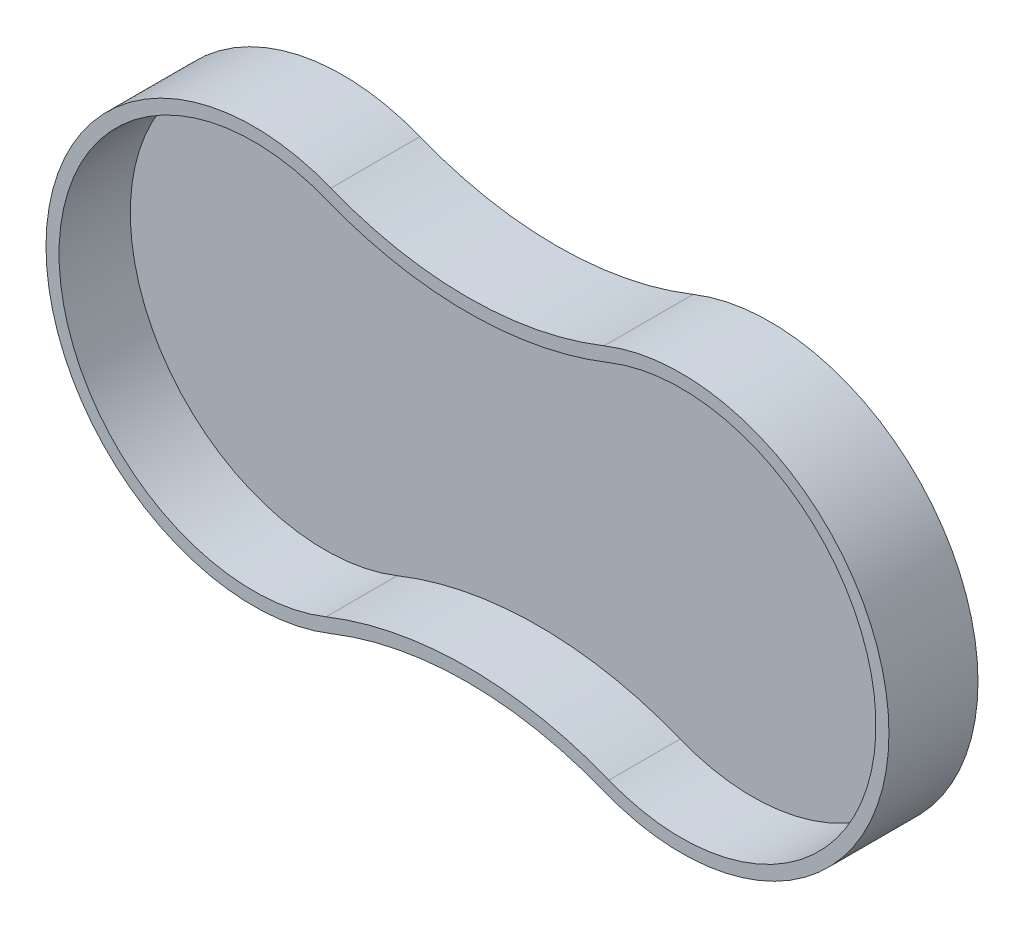
ISO-10303-21;
HEADER;
FILE_DESCRIPTION(('STEP AP214'),'2;1');
FILE_NAME('part.step','',(''),(''),'','','');
FILE_SCHEMA(('AUTOMOTIVE_DESIGN { 1 0 10303 214 1 1 1 1 }'));
ENDSEC;
DATA;
#1=APPLICATION_CONTEXT('core data for automotive mechanical design processes');
#2=APPLICATION_PROTOCOL_DEFINITION('international standard','automotive_design',2000,#1);
#3=PRODUCT_CONTEXT('',#1,'mechanical');
#4=PRODUCT('Part','Part','',(#3));
#5=PRODUCT_RELATED_PRODUCT_CATEGORY('part','',(#4));
#6=PRODUCT_DEFINITION_FORMATION('','',#4);
#7=PRODUCT_DEFINITION_CONTEXT('part definition',#1,'design');
#8=PRODUCT_DEFINITION('design','',#6,#7);
#9=PRODUCT_DEFINITION_SHAPE('','',#8);
#10=(LENGTH_UNIT() NAMED_UNIT(*) SI_UNIT(.MILLI.,.METRE.));
#11=(NAMED_UNIT(*) PLANE_ANGLE_UNIT() SI_UNIT($,.RADIAN.));
#12=(NAMED_UNIT(*) SI_UNIT($,.STERADIAN.) SOLID_ANGLE_UNIT());
#13=UNCERTAINTY_MEASURE_WITH_UNIT(LENGTH_MEASURE(1.E-05),#10,'distance_accuracy_value','');
#14=(GEOMETRIC_REPRESENTATION_CONTEXT(3) GLOBAL_UNCERTAINTY_ASSIGNED_CONTEXT((#13)) GLOBAL_UNIT_ASSIGNED_CONTEXT((#10,
#11,#12)) REPRESENTATION_CONTEXT('',''));
#15=CARTESIAN_POINT('',(0.,0.,0.));
#16=DIRECTION('',(0.,0.,1.));
#17=DIRECTION('',(1.,0.,0.));
#18=AXIS2_PLACEMENT_3D('',#15,#16,#17);
#19=CARTESIAN_POINT('',(18.,45.0333209967907,15.));
#20=DIRECTION('',(0.,0.,1.));
#21=DIRECTION('',(1.,0.,0.));
#22=AXIS2_PLACEMENT_3D('',#19,#20,#21);
#23=PLANE('',#22);
#24=CARTESIAN_POINT('',(0.,90.0666419935814,15.));
#25=DIRECTION('',(0.,0.,-1.));
#26=DIRECTION('',(1.,0.,0.));
#27=AXIS2_PLACEMENT_3D('',#24,#25,#26);
#28=CIRCLE('',#27,61.994845223857);
#29=CARTESIAN_POINT('',(23.0096189432334,32.5,15.));
#30=VERTEX_POINT('',#29);
#31=CARTESIAN_POINT('',(-23.0096189432334,32.5,15.));
#32=VERTEX_POINT('',#31);
#33=EDGE_CURVE('E150',#30,#32,#28,.T.);
#34=ORIENTED_EDGE('',*,*,#33,.T.);
#35=CARTESIAN_POINT('',(-36.,0.,15.));
#36=DIRECTION('',(0.,0.,1.));
#37=DIRECTION('',(1.,0.,0.));
#38=AXIS2_PLACEMENT_3D('',#35,#36,#37);
#39=CIRCLE('',#38,35.);
#40=CARTESIAN_POINT('',(-23.0096189432334,-32.5,15.));
#41=VERTEX_POINT('',#40);
#42=EDGE_CURVE('E89',#32,#41,#39,.T.);
#43=ORIENTED_EDGE('',*,*,#42,.T.);
#44=CARTESIAN_POINT('',(0.,-90.0666419935814,15.));
#45=DIRECTION('',(0.,0.,-1.));
#46=DIRECTION('',(-1.,0.,0.));
#47=AXIS2_PLACEMENT_3D('',#44,#45,#46);
#48=CIRCLE('',#47,61.994845223857);
#49=CARTESIAN_POINT('',(23.0096189432334,-32.5,15.));
#50=VERTEX_POINT('',#49);
#51=EDGE_CURVE('E153',#41,#50,#48,.T.);
#52=ORIENTED_EDGE('',*,*,#51,.T.);
#53=CARTESIAN_POINT('',(36.,0.,15.));
#54=DIRECTION('',(0.,0.,1.));
#55=DIRECTION('',(1.,0.,0.));
#56=AXIS2_PLACEMENT_3D('',#53,#54,#55);
#57=CIRCLE('',#56,35.);
#58=EDGE_CURVE('E61',#50,#30,#57,.T.);
#59=ORIENTED_EDGE('',*,*,#58,.T.);
#60=EDGE_LOOP('',(#34,#43,#52,#59));
#61=FACE_BOUND('',#60,.T.);
#62=CARTESIAN_POINT('',(-36.,0.,15.));
#63=DIRECTION('',(0.,0.,1.));
#64=DIRECTION('',(1.,0.,0.));
#65=AXIS2_PLACEMENT_3D('',#62,#63,#64);
#66=CIRCLE('',#65,32.8);
#67=CARTESIAN_POINT('',(-23.8261571810873,30.4571428571429,15.));
#68=VERTEX_POINT('',#67);
#69=CARTESIAN_POINT('',(-23.8261571810873,-30.4571428571429,15.));
#70=VERTEX_POINT('',#69);
#71=EDGE_CURVE('E52',#68,#70,#66,.T.);
#72=ORIENTED_EDGE('',*,*,#71,.F.);
#73=CARTESIAN_POINT('',(0.,90.0666419935814,15.));
#74=DIRECTION('',(0.,0.,-1.));
#75=DIRECTION('',(1.,0.,0.));
#76=AXIS2_PLACEMENT_3D('',#73,#74,#75);
#77=CIRCLE('',#76,64.194845223857);
#78=CARTESIAN_POINT('',(23.8261571810873,30.4571428571428,15.));
#79=VERTEX_POINT('',#78);
#80=EDGE_CURVE('E131',#79,#68,#77,.T.);
#81=ORIENTED_EDGE('',*,*,#80,.F.);
#82=CARTESIAN_POINT('',(36.,0.,15.));
#83=DIRECTION('',(0.,0.,1.));
#84=DIRECTION('',(1.,0.,0.));
#85=AXIS2_PLACEMENT_3D('',#82,#83,#84);
#86=CIRCLE('',#85,32.8);
#87=CARTESIAN_POINT('',(23.8261571810873,-30.4571428571429,15.));
#88=VERTEX_POINT('',#87);
#89=EDGE_CURVE('E134',#88,#79,#86,.T.);
#90=ORIENTED_EDGE('',*,*,#89,.F.);
#91=CARTESIAN_POINT('',(0.,-90.0666419935814,15.));
#92=DIRECTION('',(0.,0.,-1.));
#93=DIRECTION('',(1.,0.,0.));
#94=AXIS2_PLACEMENT_3D('',#91,#92,#93);
#95=CIRCLE('',#94,64.1948452238569);
#96=EDGE_CURVE('E140',#70,#88,#95,.T.);
#97=ORIENTED_EDGE('',*,*,#96,.F.);
#98=EDGE_LOOP('',(#72,#81,#90,#97));
#99=FACE_BOUND('',#98,.T.);
#100=ADVANCED_FACE('F37',(#61,#99),#23,.T.);
#101=CARTESIAN_POINT('',(0.,90.0666419935814,15.));
#102=DIRECTION('',(0.,0.,-1.));
#103=DIRECTION('',(-1.,0.,0.));
#104=AXIS2_PLACEMENT_3D('',#101,#102,#103);
#105=CYLINDRICAL_SURFACE('',#104,61.994845223857);
#106=CARTESIAN_POINT('',(0.,90.0666419935814,0.));
#107=DIRECTION('',(0.,0.,-1.));
#108=DIRECTION('',(1.,0.,0.));
#109=AXIS2_PLACEMENT_3D('',#106,#107,#108);
#110=CIRCLE('',#109,61.994845223857);
#111=CARTESIAN_POINT('',(23.0096189432334,32.5,0.));
#112=VERTEX_POINT('',#111);
#113=CARTESIAN_POINT('',(-23.0096189432334,32.5,0.));
#114=VERTEX_POINT('',#113);
#115=EDGE_CURVE('E146',#112,#114,#110,.T.);
#116=ORIENTED_EDGE('',*,*,#115,.T.);
#117=DIRECTION('',(0.,0.,-1.));
#118=VECTOR('',#117,1.);
#119=CARTESIAN_POINT('',(-23.0096189432334,32.5,15.));
#120=LINE('',#119,#118);
#121=EDGE_CURVE('E11',#32,#114,#120,.T.);
#122=ORIENTED_EDGE('',*,*,#121,.F.);
#123=ORIENTED_EDGE('',*,*,#33,.F.);
#124=DIRECTION('',(0.,0.,-1.));
#125=VECTOR('',#124,1.);
#126=CARTESIAN_POINT('',(23.0096189432334,32.5,15.));
#127=LINE('',#126,#125);
#128=EDGE_CURVE('E156',#30,#112,#127,.T.);
#129=ORIENTED_EDGE('',*,*,#128,.T.);
#130=EDGE_LOOP('',(#116,#122,#123,#129));
#131=FACE_BOUND('',#130,.T.);
#132=ADVANCED_FACE('F39',(#131),#105,.F.);
#133=CARTESIAN_POINT('',(-36.,0.,15.));
#134=DIRECTION('',(0.,0.,-1.));
#135=DIRECTION('',(-1.,0.,0.));
#136=AXIS2_PLACEMENT_3D('',#133,#134,#135);
#137=CYLINDRICAL_SURFACE('',#136,35.);
#138=CARTESIAN_POINT('',(-36.,0.,0.));
#139=DIRECTION('',(0.,0.,1.));
#140=DIRECTION('',(1.,0.,0.));
#141=AXIS2_PLACEMENT_3D('',#138,#139,#140);
#142=CIRCLE('',#141,35.);
#143=CARTESIAN_POINT('',(-23.0096189432334,-32.5,0.));
#144=VERTEX_POINT('',#143);
#145=EDGE_CURVE('E159',#114,#144,#142,.T.);
#146=ORIENTED_EDGE('',*,*,#145,.T.);
#147=DIRECTION('',(0.,0.,-1.));
#148=VECTOR('',#147,1.);
#149=CARTESIAN_POINT('',(-23.0096189432334,-32.5,15.));
#150=LINE('',#149,#148);
#151=EDGE_CURVE('E45',#41,#144,#150,.T.);
#152=ORIENTED_EDGE('',*,*,#151,.F.);
#153=ORIENTED_EDGE('',*,*,#42,.F.);
#154=ORIENTED_EDGE('',*,*,#121,.T.);
#155=EDGE_LOOP('',(#146,#152,#153,#154));
#156=FACE_BOUND('',#155,.T.);
#157=ADVANCED_FACE('F186',(#156),#137,.T.);
#158=CARTESIAN_POINT('',(0.,-90.0666419935814,15.));
#159=DIRECTION('',(0.,0.,-1.));
#160=DIRECTION('',(-1.,0.,0.));
#161=AXIS2_PLACEMENT_3D('',#158,#159,#160);
#162=CYLINDRICAL_SURFACE('',#161,61.994845223857);
#163=CARTESIAN_POINT('',(0.,-90.0666419935814,0.));
#164=DIRECTION('',(0.,0.,-1.));
#165=DIRECTION('',(-1.,0.,0.));
#166=AXIS2_PLACEMENT_3D('',#163,#164,#165);
#167=CIRCLE('',#166,61.994845223857);
#168=CARTESIAN_POINT('',(23.0096189432334,-32.5,0.));
#169=VERTEX_POINT('',#168);
#170=EDGE_CURVE('E161',#144,#169,#167,.T.);
#171=ORIENTED_EDGE('',*,*,#170,.T.);
#172=DIRECTION('',(0.,0.,-1.));
#173=VECTOR('',#172,1.);
#174=CARTESIAN_POINT('',(23.0096189432334,-32.5,15.));
#175=LINE('',#174,#173);
#176=EDGE_CURVE('E165',#50,#169,#175,.T.);
#177=ORIENTED_EDGE('',*,*,#176,.F.);
#178=ORIENTED_EDGE('',*,*,#51,.F.);
#179=ORIENTED_EDGE('',*,*,#151,.T.);
#180=EDGE_LOOP('',(#171,#177,#178,#179));
#181=FACE_BOUND('',#180,.T.);
#182=ADVANCED_FACE('F170',(#181),#162,.F.);
#183=CARTESIAN_POINT('',(36.,0.,15.));
#184=DIRECTION('',(0.,0.,-1.));
#185=DIRECTION('',(-1.,0.,0.));
#186=AXIS2_PLACEMENT_3D('',#183,#184,#185);
#187=CYLINDRICAL_SURFACE('',#186,35.);
#188=CARTESIAN_POINT('',(36.,0.,0.));
#189=DIRECTION('',(0.,0.,1.));
#190=DIRECTION('',(1.,0.,0.));
#191=AXIS2_PLACEMENT_3D('',#188,#189,#190);
#192=CIRCLE('',#191,35.);
#193=EDGE_CURVE('E82',#169,#112,#192,.T.);
#194=ORIENTED_EDGE('',*,*,#193,.T.);
#195=ORIENTED_EDGE('',*,*,#128,.F.);
#196=ORIENTED_EDGE('',*,*,#58,.F.);
#197=ORIENTED_EDGE('',*,*,#176,.T.);
#198=EDGE_LOOP('',(#194,#195,#196,#197));
#199=FACE_BOUND('',#198,.T.);
#200=ADVANCED_FACE('F178',(#199),#187,.T.);
#201=CARTESIAN_POINT('',(18.,45.0333209967907,0.));
#202=DIRECTION('',(0.,0.,1.));
#203=DIRECTION('',(1.,0.,0.));
#204=AXIS2_PLACEMENT_3D('',#201,#202,#203);
#205=PLANE('',#204);
#206=ORIENTED_EDGE('',*,*,#115,.F.);
#207=ORIENTED_EDGE('',*,*,#193,.F.);
#208=ORIENTED_EDGE('',*,*,#170,.F.);
#209=ORIENTED_EDGE('',*,*,#145,.F.);
#210=EDGE_LOOP('',(#206,#207,#208,#209));
#211=FACE_BOUND('',#210,.T.);
#212=ADVANCED_FACE('F174',(#211),#205,.F.);
#213=CARTESIAN_POINT('',(-36.,0.,3.));
#214=DIRECTION('',(0.,0.,1.));
#215=DIRECTION('',(1.,0.,0.));
#216=AXIS2_PLACEMENT_3D('',#213,#214,#215);
#217=CYLINDRICAL_SURFACE('',#216,32.8);
#218=ORIENTED_EDGE('',*,*,#71,.T.);
#219=DIRECTION('',(0.,0.,1.));
#220=VECTOR('',#219,1.);
#221=CARTESIAN_POINT('',(-23.8261571810873,-30.4571428571429,3.));
#222=LINE('',#221,#220);
#223=CARTESIAN_POINT('',(-23.8261571810873,-30.4571428571429,3.));
#224=VERTEX_POINT('',#223);
#225=EDGE_CURVE('E109',#224,#70,#222,.T.);
#226=ORIENTED_EDGE('',*,*,#225,.F.);
#227=CARTESIAN_POINT('',(-36.,0.,3.));
#228=DIRECTION('',(0.,0.,1.));
#229=DIRECTION('',(1.,0.,0.));
#230=AXIS2_PLACEMENT_3D('',#227,#228,#229);
#231=CIRCLE('',#230,32.8);
#232=CARTESIAN_POINT('',(-23.8261571810873,30.4571428571429,3.));
#233=VERTEX_POINT('',#232);
#234=EDGE_CURVE('E113',#233,#224,#231,.T.);
#235=ORIENTED_EDGE('',*,*,#234,.F.);
#236=DIRECTION('',(0.,0.,1.));
#237=VECTOR('',#236,1.);
#238=CARTESIAN_POINT('',(-23.8261571810873,30.4571428571429,3.));
#239=LINE('',#238,#237);
#240=EDGE_CURVE('E144',#233,#68,#239,.T.);
#241=ORIENTED_EDGE('',*,*,#240,.T.);
#242=EDGE_LOOP('',(#218,#226,#235,#241));
#243=FACE_BOUND('',#242,.T.);
#244=ADVANCED_FACE('F111',(#243),#217,.F.);
#245=CARTESIAN_POINT('',(0.,90.0666419935814,3.));
#246=DIRECTION('',(0.,0.,1.));
#247=DIRECTION('',(1.,0.,0.));
#248=AXIS2_PLACEMENT_3D('',#245,#246,#247);
#249=CYLINDRICAL_SURFACE('',#248,64.194845223857);
#250=ORIENTED_EDGE('',*,*,#80,.T.);
#251=ORIENTED_EDGE('',*,*,#240,.F.);
#252=CARTESIAN_POINT('',(0.,90.0666419935814,3.));
#253=DIRECTION('',(0.,0.,-1.));
#254=DIRECTION('',(1.,0.,0.));
#255=AXIS2_PLACEMENT_3D('',#252,#253,#254);
#256=CIRCLE('',#255,64.194845223857);
#257=CARTESIAN_POINT('',(23.8261571810873,30.4571428571428,3.));
#258=VERTEX_POINT('',#257);
#259=EDGE_CURVE('E119',#258,#233,#256,.T.);
#260=ORIENTED_EDGE('',*,*,#259,.F.);
#261=DIRECTION('',(0.,0.,1.));
#262=VECTOR('',#261,1.);
#263=CARTESIAN_POINT('',(23.8261571810873,30.4571428571428,3.));
#264=LINE('',#263,#262);
#265=EDGE_CURVE('E147',#258,#79,#264,.T.);
#266=ORIENTED_EDGE('',*,*,#265,.T.);
#267=EDGE_LOOP('',(#250,#251,#260,#266));
#268=FACE_BOUND('',#267,.T.);
#269=ADVANCED_FACE('F197',(#268),#249,.T.);
#270=CARTESIAN_POINT('',(36.,0.,3.));
#271=DIRECTION('',(0.,0.,1.));
#272=DIRECTION('',(1.,0.,0.));
#273=AXIS2_PLACEMENT_3D('',#270,#271,#272);
#274=CYLINDRICAL_SURFACE('',#273,32.8);
#275=ORIENTED_EDGE('',*,*,#89,.T.);
#276=ORIENTED_EDGE('',*,*,#265,.F.);
#277=CARTESIAN_POINT('',(36.,0.,3.));
#278=DIRECTION('',(0.,0.,1.));
#279=DIRECTION('',(1.,0.,0.));
#280=AXIS2_PLACEMENT_3D('',#277,#278,#279);
#281=CIRCLE('',#280,32.8);
#282=CARTESIAN_POINT('',(23.8261571810873,-30.4571428571429,3.));
#283=VERTEX_POINT('',#282);
#284=EDGE_CURVE('E127',#283,#258,#281,.T.);
#285=ORIENTED_EDGE('',*,*,#284,.F.);
#286=DIRECTION('',(0.,0.,1.));
#287=VECTOR('',#286,1.);
#288=CARTESIAN_POINT('',(23.8261571810873,-30.4571428571429,3.));
#289=LINE('',#288,#287);
#290=EDGE_CURVE('E118',#283,#88,#289,.T.);
#291=ORIENTED_EDGE('',*,*,#290,.T.);
#292=EDGE_LOOP('',(#275,#276,#285,#291));
#293=FACE_BOUND('',#292,.T.);
#294=ADVANCED_FACE('F200',(#293),#274,.F.);
#295=CARTESIAN_POINT('',(0.,-90.0666419935814,3.));
#296=DIRECTION('',(0.,0.,1.));
#297=DIRECTION('',(1.,0.,0.));
#298=AXIS2_PLACEMENT_3D('',#295,#296,#297);
#299=CYLINDRICAL_SURFACE('',#298,64.1948452238569);
#300=ORIENTED_EDGE('',*,*,#96,.T.);
#301=ORIENTED_EDGE('',*,*,#290,.F.);
#302=CARTESIAN_POINT('',(0.,-90.0666419935814,3.));
#303=DIRECTION('',(0.,0.,-1.));
#304=DIRECTION('',(1.,0.,0.));
#305=AXIS2_PLACEMENT_3D('',#302,#303,#304);
#306=CIRCLE('',#305,64.1948452238569);
#307=EDGE_CURVE('E122',#224,#283,#306,.T.);
#308=ORIENTED_EDGE('',*,*,#307,.F.);
#309=ORIENTED_EDGE('',*,*,#225,.T.);
#310=EDGE_LOOP('',(#300,#301,#308,#309));
#311=FACE_BOUND('',#310,.T.);
#312=ADVANCED_FACE('F123',(#311),#299,.T.);
#313=CARTESIAN_POINT('',(-18.,-45.0333209967907,3.));
#314=DIRECTION('',(0.,0.,1.));
#315=DIRECTION('',(1.,0.,0.));
#316=AXIS2_PLACEMENT_3D('',#313,#314,#315);
#317=PLANE('',#316);
#318=ORIENTED_EDGE('',*,*,#234,.T.);
#319=ORIENTED_EDGE('',*,*,#307,.T.);
#320=ORIENTED_EDGE('',*,*,#284,.T.);
#321=ORIENTED_EDGE('',*,*,#259,.T.);
#322=EDGE_LOOP('',(#318,#319,#320,#321));
#323=FACE_BOUND('',#322,.T.);
#324=ADVANCED_FACE('F129',(#323),#317,.T.);
#325=CLOSED_SHELL('',(#100,#132,#157,#182,#200,#212,#244,#269,#294,#312,#324));
#326=MANIFOLD_SOLID_BREP('B2',#325);
#327=ADVANCED_BREP_SHAPE_REPRESENTATION('',(#18,#326),#14);
#328=SHAPE_DEFINITION_REPRESENTATION(#9,#327);
ENDSEC;
END-ISO-10303-21;
